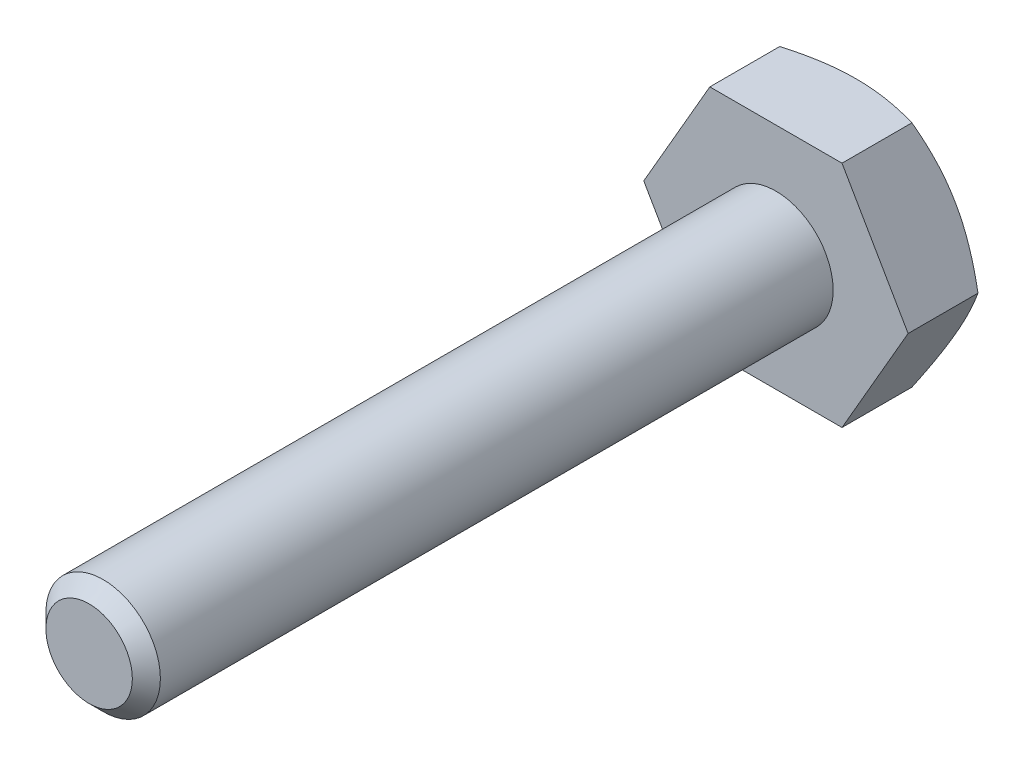
ISO-10303-21;
HEADER;
FILE_DESCRIPTION(('STEP AP214'),'2;1');
FILE_NAME('part.step','',(''),(''),'','','');
FILE_SCHEMA(('AUTOMOTIVE_DESIGN { 1 0 10303 214 1 1 1 1 }'));
ENDSEC;
DATA;
#1=APPLICATION_CONTEXT('core data for automotive mechanical design processes');
#2=APPLICATION_PROTOCOL_DEFINITION('international standard','automotive_design',2000,#1);
#3=PRODUCT_CONTEXT('',#1,'mechanical');
#4=PRODUCT('Part','Part','',(#3));
#5=PRODUCT_RELATED_PRODUCT_CATEGORY('part','',(#4));
#6=PRODUCT_DEFINITION_FORMATION('','',#4);
#7=PRODUCT_DEFINITION_CONTEXT('part definition',#1,'design');
#8=PRODUCT_DEFINITION('design','',#6,#7);
#9=PRODUCT_DEFINITION_SHAPE('','',#8);
#10=(LENGTH_UNIT() NAMED_UNIT(*) SI_UNIT(.MILLI.,.METRE.));
#11=(NAMED_UNIT(*) PLANE_ANGLE_UNIT() SI_UNIT($,.RADIAN.));
#12=(NAMED_UNIT(*) SI_UNIT($,.STERADIAN.) SOLID_ANGLE_UNIT());
#13=UNCERTAINTY_MEASURE_WITH_UNIT(LENGTH_MEASURE(1.E-05),#10,'distance_accuracy_value','');
#14=(GEOMETRIC_REPRESENTATION_CONTEXT(3) GLOBAL_UNCERTAINTY_ASSIGNED_CONTEXT((#13)) GLOBAL_UNIT_ASSIGNED_CONTEXT((#10,
#11,#12)) REPRESENTATION_CONTEXT('',''));
#15=CARTESIAN_POINT('',(0.,0.,0.));
#16=DIRECTION('',(0.,0.,1.));
#17=DIRECTION('',(1.,0.,0.));
#18=AXIS2_PLACEMENT_3D('',#15,#16,#17);
#19=CARTESIAN_POINT('',(1.15470053837925,-2.,1.4));
#20=DIRECTION('',(-0.866025403784439,0.5,0.));
#21=DIRECTION('',(-0.5,-0.866025403784439,0.));
#22=AXIS2_PLACEMENT_3D('',#19,#20,#21);
#23=PLANE('',#22);
#24=CARTESIAN_POINT('',(2.30951654681234,0.000200000000002191,0.1786994666205));
#25=CARTESIAN_POINT('',(2.25877250251758,-0.0876912629000578,0.149389536100684));
#26=CARTESIAN_POINT('',(2.20759044065996,-0.176341194473589,0.122732851980475));
#27=CARTESIAN_POINT('',(2.10433997494456,-0.355176246997799,0.0762024910207337));
#28=CARTESIAN_POINT('',(2.05226973594631,-0.445364546505033,0.0563452763827937));
#29=CARTESIAN_POINT('',(1.94877459684593,-0.624623385763302,0.0254334640232692));
#30=CARTESIAN_POINT('',(1.89736562427197,-0.7136663382263,0.0141731515985483));
#31=CARTESIAN_POINT('',(1.79430568008403,-0.892171397785038,0.00072866259465937));
#32=CARTESIAN_POINT('',(1.74265508327245,-0.981632855703953,-0.0014666450465144));
#33=CARTESIAN_POINT('',(1.64613626458982,-1.14880835354879,0.00309098933066325));
#34=CARTESIAN_POINT('',(1.60125362236173,-1.22654737026578,0.00872487468702659));
#35=CARTESIAN_POINT('',(1.51178075956051,-1.38151891453613,0.0265838952608438));
#36=CARTESIAN_POINT('',(1.46719084864821,-1.45875090574119,0.0388151360234607));
#37=CARTESIAN_POINT('',(1.37753338590959,-1.6140421864822,0.0693934368676312));
#38=CARTESIAN_POINT('',(1.33247718647009,-1.69208181310738,0.0878701670657312));
#39=CARTESIAN_POINT('',(1.24303693915875,-1.84699686569213,0.12980551821286));
#40=CARTESIAN_POINT('',(1.1986517446858,-1.92387427762312,0.153254280492312));
#41=CARTESIAN_POINT('',(1.15458506832541,-2.0002,0.178699466620498));
#42=B_SPLINE_CURVE_WITH_KNOTS('',3,(#24,#25,#26,#27,#28,#29,#30,#31,#32,#33,#34,#35,#36,#37,#38,
#39,#40,#41),.UNSPECIFIED.,.F.,.F.,(4,2,2,2,2,2,2,2,4),(0.,0.317031824695607,0.634825876346559,
0.944753967652631,1.25430138000371,1.52387047293093,1.79368946861028,2.06949491027633,
2.34475850821472),.UNSPECIFIED.);
#43=CARTESIAN_POINT('',(2.30940107675846,0.,0.178632794954067));
#44=VERTEX_POINT('',#43);
#45=CARTESIAN_POINT('',(1.73205080756888,-1.,0.));
#46=VERTEX_POINT('',#45);
#47=EDGE_CURVE('E130',#44,#46,#42,.T.);
#48=ORIENTED_EDGE('',*,*,#47,.F.);
#49=DIRECTION('',(0.,0.,-1.));
#50=VECTOR('',#49,1.);
#51=CARTESIAN_POINT('',(2.3094010767585,0.,1.4));
#52=LINE('',#51,#50);
#53=CARTESIAN_POINT('',(2.3094010767585,0.,1.4));
#54=VERTEX_POINT('',#53);
#55=EDGE_CURVE('E134',#54,#44,#52,.T.);
#56=ORIENTED_EDGE('',*,*,#55,.F.);
#57=DIRECTION('',(0.5,0.866025403784439,0.));
#58=VECTOR('',#57,1.);
#59=CARTESIAN_POINT('',(1.15470053837925,-2.,1.4));
#60=LINE('',#59,#58);
#61=CARTESIAN_POINT('',(1.15470053837925,-2.,1.4));
#62=VERTEX_POINT('',#61);
#63=EDGE_CURVE('E248',#62,#54,#60,.T.);
#64=ORIENTED_EDGE('',*,*,#63,.F.);
#65=DIRECTION('',(0.,0.,-1.));
#66=VECTOR('',#65,1.);
#67=CARTESIAN_POINT('',(1.15470053837925,-2.,1.4));
#68=LINE('',#67,#66);
#69=CARTESIAN_POINT('',(1.15470053837916,-2.,0.178632794954062));
#70=VERTEX_POINT('',#69);
#71=EDGE_CURVE('E224',#62,#70,#68,.T.);
#72=ORIENTED_EDGE('',*,*,#71,.T.);
#73=EDGE_CURVE('E187',#46,#70,#42,.T.);
#74=ORIENTED_EDGE('',*,*,#73,.F.);
#75=EDGE_LOOP('',(#48,#56,#64,#72,#74));
#76=FACE_BOUND('',#75,.T.);
#77=ADVANCED_FACE('F38',(#76),#23,.F.);
#78=CARTESIAN_POINT('',(2.3094010767585,0.,1.4));
#79=DIRECTION('',(-0.866025403784438,-0.5,0.));
#80=DIRECTION('',(0.5,-0.866025403784438,0.));
#81=AXIS2_PLACEMENT_3D('',#78,#79,#80);
#82=PLANE('',#81);
#83=CARTESIAN_POINT('',(1.15458506832541,2.0002,0.178699466620506));
#84=CARTESIAN_POINT('',(1.20532911262018,1.91230873709994,0.149389536100688));
#85=CARTESIAN_POINT('',(1.2565111744778,1.82365880552641,0.122732851980478));
#86=CARTESIAN_POINT('',(1.35976164019319,1.6448237530022,0.0762024910207348));
#87=CARTESIAN_POINT('',(1.41183187919145,1.55463545349497,0.056345276382794));
#88=CARTESIAN_POINT('',(1.51532701829183,1.3753766142367,0.0254334640232685));
#89=CARTESIAN_POINT('',(1.56673599086578,1.2863336617737,0.0141731515985472));
#90=CARTESIAN_POINT('',(1.66979593505373,1.10782860221496,0.000728662594657717));
#91=CARTESIAN_POINT('',(1.72144653186531,1.01836714429605,-0.00146664504651619));
#92=CARTESIAN_POINT('',(1.81796535054794,0.851191646451207,0.00309098933066134));
#93=CARTESIAN_POINT('',(1.86284799277603,0.773452629734221,0.0087248746870247));
#94=CARTESIAN_POINT('',(1.95232085557725,0.618481085463871,0.0265838952608436));
#95=CARTESIAN_POINT('',(1.99691076648954,0.541249094258806,0.0388151360234621));
#96=CARTESIAN_POINT('',(2.08656822922816,0.385957813517802,0.069393436867631));
#97=CARTESIAN_POINT('',(2.13162442866767,0.307918186892621,0.0878701670657276));
#98=CARTESIAN_POINT('',(2.221064675979,0.153003134307863,0.129805518212855));
#99=CARTESIAN_POINT('',(2.26544987045196,0.076125722376877,0.153254280492309));
#100=CARTESIAN_POINT('',(2.30951654681234,-0.000200000000001502,0.178699466620505));
#101=B_SPLINE_CURVE_WITH_KNOTS('',3,(#83,#84,#85,#86,#87,#88,#89,#90,#91,#92,#93,#94,#95,#96,
#97,#98,#99,#100),.UNSPECIFIED.,.F.,.F.,(4,2,2,2,2,2,2,2,4),(0.,0.317031824695607,
0.634825876346559,0.94475396765263,1.2543013800037,1.52387047293093,1.79368946861028,
2.06949491027634,2.34475850821472),.UNSPECIFIED.);
#102=CARTESIAN_POINT('',(1.1547005383793,1.99999999999992,0.178632794954066));
#103=VERTEX_POINT('',#102);
#104=CARTESIAN_POINT('',(1.73205080756888,1.,0.));
#105=VERTEX_POINT('',#104);
#106=EDGE_CURVE('E109',#103,#105,#101,.T.);
#107=ORIENTED_EDGE('',*,*,#106,.F.);
#108=DIRECTION('',(0.,0.,-1.));
#109=VECTOR('',#108,1.);
#110=CARTESIAN_POINT('',(1.15470053837925,2.,1.4));
#111=LINE('',#110,#109);
#112=CARTESIAN_POINT('',(1.15470053837925,2.,1.4));
#113=VERTEX_POINT('',#112);
#114=EDGE_CURVE('E233',#113,#103,#111,.T.);
#115=ORIENTED_EDGE('',*,*,#114,.F.);
#116=DIRECTION('',(-0.5,0.866025403784438,0.));
#117=VECTOR('',#116,1.);
#118=CARTESIAN_POINT('',(2.3094010767585,0.,1.4));
#119=LINE('',#118,#117);
#120=EDGE_CURVE('E252',#54,#113,#119,.T.);
#121=ORIENTED_EDGE('',*,*,#120,.F.);
#122=ORIENTED_EDGE('',*,*,#55,.T.);
#123=EDGE_CURVE('E122',#105,#44,#101,.T.);
#124=ORIENTED_EDGE('',*,*,#123,.F.);
#125=EDGE_LOOP('',(#107,#115,#121,#122,#124));
#126=FACE_BOUND('',#125,.T.);
#127=ADVANCED_FACE('F142',(#126),#82,.F.);
#128=CARTESIAN_POINT('',(1.15470053837925,2.,1.4));
#129=DIRECTION('',(0.,-1.,0.));
#130=DIRECTION('',(0.,0.,-1.));
#131=AXIS2_PLACEMENT_3D('',#128,#129,#130);
#132=PLANE('',#131);
#133=CARTESIAN_POINT('',(-3.13534334829022,2.,0.992419851947267));
#134=CARTESIAN_POINT('',(-3.04769056741261,2.,0.94976607451534));
#135=CARTESIAN_POINT('',(-2.95984013138572,2.,0.907511692400299));
#136=CARTESIAN_POINT('',(-2.78363894118423,2.,0.824025729231618));
#137=CARTESIAN_POINT('',(-2.69528811369076,2.,0.782794303090245));
#138=CARTESIAN_POINT('',(-2.51754201332114,2.,0.701378042506422));
#139=CARTESIAN_POINT('',(-2.42814369215806,2.,0.661199840612384));
#140=CARTESIAN_POINT('',(-2.248647562412,2.,0.582443619303133));
#141=CARTESIAN_POINT('',(-2.15854978616801,2.,0.54386552642451));
#142=CARTESIAN_POINT('',(-1.97449120953333,2.,0.467477454310918));
#143=CARTESIAN_POINT('',(-1.88050180526061,2.,0.429736028966731));
#144=CARTESIAN_POINT('',(-1.69145457213209,2.,0.357036466167304));
#145=CARTESIAN_POINT('',(-1.5963968380452,2.,0.322078084024595));
#146=CARTESIAN_POINT('',(-1.40520112576382,2.,0.255825829286189));
#147=CARTESIAN_POINT('',(-1.30906552059303,2.,0.224525175755738));
#148=CARTESIAN_POINT('',(-1.11541575793119,2.,0.166574285470996));
#149=CARTESIAN_POINT('',(-1.01790203404881,2.,0.139922619696653));
#150=CARTESIAN_POINT('',(-0.821976174511055,2.,0.0926670884452833));
#151=CARTESIAN_POINT('',(-0.723572216859774,2.,0.0720299350199858));
#152=CARTESIAN_POINT('',(-0.525507010533388,2.,0.03794899894518));
#153=CARTESIAN_POINT('',(-0.425845896027191,2.,0.024504455209211));
#154=CARTESIAN_POINT('',(-0.227075895666027,2.,0.00605918306906894));
#155=CARTESIAN_POINT('',(-0.127977630916021,2.,0.000947242980576258));
#156=CARTESIAN_POINT('',(0.0702888231789155,2.,-0.000707077894732916));
#157=CARTESIAN_POINT('',(0.169457013763535,2.,0.0027506972713517));
#158=CARTESIAN_POINT('',(0.405340987917955,2.,0.0208712518656598));
#159=CARTESIAN_POINT('',(0.54176641390941,2.,0.0393457317957802));
#160=CARTESIAN_POINT('',(0.812197875489501,2.,0.0893685196574088));
#161=CARTESIAN_POINT('',(0.946201565003888,2.,0.120928863137604));
#162=CARTESIAN_POINT('',(1.21460196893192,2.,0.194491535397711));
#163=CARTESIAN_POINT('',(1.34893512979176,2.,0.236719970019415));
#164=CARTESIAN_POINT('',(1.54855280747333,2.,0.305342715351825));
#165=CARTESIAN_POINT('',(1.61477299958935,2.,0.329094813825006));
#166=CARTESIAN_POINT('',(1.74666219780875,2.,0.378083109216497));
#167=CARTESIAN_POINT('',(1.8123312154833,2.,0.403319274889279));
#168=CARTESIAN_POINT('',(1.98595823229527,2.,0.471931368670434));
#169=CARTESIAN_POINT('',(2.09349170602536,2.,0.516378893507379));
#170=CARTESIAN_POINT('',(2.30748039073841,2.,0.60780685198962));
#171=CARTESIAN_POINT('',(2.4139354942457,2.,0.654787535208232));
#172=CARTESIAN_POINT('',(2.62600576848778,2.,0.750691732943658));
#173=CARTESIAN_POINT('',(2.73162065432965,2.,0.79961587532843));
#174=CARTESIAN_POINT('',(2.94214604404922,2.,0.898959617553906));
#175=CARTESIAN_POINT('',(3.04705652749655,2.,0.949379260542065));
#176=CARTESIAN_POINT('',(3.36124828857341,2.,1.10253125959176));
#177=CARTESIAN_POINT('',(3.5696761290435,2.,1.20701228486226));
#178=CARTESIAN_POINT('',(3.98496523954024,2.,1.41892202629211));
#179=CARTESIAN_POINT('',(4.19182680591951,2.,1.52635016609927));
#180=CARTESIAN_POINT('',(4.58330895745404,2.,1.7321007326676));
#181=CARTESIAN_POINT('',(4.76803326976603,2.,1.83022614129034));
#182=CARTESIAN_POINT('',(5.13685390610821,2.,2.02767337911895));
#183=CARTESIAN_POINT('',(5.32095019358253,2.,2.1269952764948));
#184=CARTESIAN_POINT('',(5.68806820425146,2.,2.32620881854463));
#185=CARTESIAN_POINT('',(5.87109147945917,2.,2.42609760652711));
#186=CARTESIAN_POINT('',(6.23674517550554,2.,2.62655964413539));
#187=CARTESIAN_POINT('',(6.41937562467911,2.,2.72713284205542));
#188=CARTESIAN_POINT('',(6.60186720952054,2.,2.82795563776509));
#189=B_SPLINE_CURVE_WITH_KNOTS('',3,(#133,#134,#135,#136,#137,#138,#139,#140,#141,#142,#143,
#144,#145,#146,#147,#148,#149,#150,#151,#152,#153,#154,#155,#156,#157,#158,#159,#160,#161,#162,
#163,#164,#165,#166,#167,#168,#169,#170,#171,#172,#173,#174,#175,#176,#177,#178,#179,#180,#181,
#182,#183,#184,#185,#186,#187,#188),.UNSPECIFIED.,.F.,.F.,(4,2,2,2,2,2,2,2,2,2,2,2,2,2,2,2,2,2,
2,2,2,2,2,2,2,2,2,4),(0.,0.292443481987672,0.58493098339391,0.878954340870048,1.17296418431592,
1.47678188482312,1.78057284385738,2.08379136768076,2.38691652239516,2.68833067284292,
2.98971292282126,3.28703880266869,3.58437009333465,3.99653269842381,4.40907522843046,
4.83122730377953,5.04226871027039,5.25330567508846,5.60233094671678,5.95139066827489,
6.30056409164291,6.64974759901018,7.34915048878023,8.04841756146948,8.67591854123585,
9.30345544358246,9.92897567671615,10.5544491664054),.UNSPECIFIED.);
#190=CARTESIAN_POINT('',(-1.1547005383793,1.99999999999992,0.178632794954067));
#191=VERTEX_POINT('',#190);
#192=CARTESIAN_POINT('',(0.,2.,0.));
#193=VERTEX_POINT('',#192);
#194=EDGE_CURVE('E53',#191,#193,#189,.T.);
#195=ORIENTED_EDGE('',*,*,#194,.F.);
#196=DIRECTION('',(0.,0.,-1.));
#197=VECTOR('',#196,1.);
#198=CARTESIAN_POINT('',(-1.15470053837925,2.,1.4));
#199=LINE('',#198,#197);
#200=CARTESIAN_POINT('',(-1.15470053837925,2.,1.4));
#201=VERTEX_POINT('',#200);
#202=EDGE_CURVE('E226',#201,#191,#199,.T.);
#203=ORIENTED_EDGE('',*,*,#202,.F.);
#204=DIRECTION('',(-1.,0.,0.));
#205=VECTOR('',#204,1.);
#206=CARTESIAN_POINT('',(1.15470053837925,2.,1.4));
#207=LINE('',#206,#205);
#208=EDGE_CURVE('E256',#113,#201,#207,.T.);
#209=ORIENTED_EDGE('',*,*,#208,.F.);
#210=ORIENTED_EDGE('',*,*,#114,.T.);
#211=EDGE_CURVE('E116',#193,#103,#189,.T.);
#212=ORIENTED_EDGE('',*,*,#211,.F.);
#213=EDGE_LOOP('',(#195,#203,#209,#210,#212));
#214=FACE_BOUND('',#213,.T.);
#215=ADVANCED_FACE('F197',(#214),#132,.F.);
#216=CARTESIAN_POINT('',(-1.15470053837925,2.,1.4));
#217=DIRECTION('',(0.866025403784439,-0.5,0.));
#218=DIRECTION('',(0.5,0.866025403784439,0.));
#219=AXIS2_PLACEMENT_3D('',#216,#217,#218);
#220=PLANE('',#219);
#221=CARTESIAN_POINT('',(-2.30951654681234,-0.000199999999999577,0.1786994666205));
#222=CARTESIAN_POINT('',(-2.25877250251757,0.0876912629000609,0.149389536100689));
#223=CARTESIAN_POINT('',(-2.20759044065995,0.176341194473591,0.122732851980478));
#224=CARTESIAN_POINT('',(-2.10433997494456,0.355176246997799,0.0762024910207319));
#225=CARTESIAN_POINT('',(-2.05226973594631,0.445364546505032,0.0563452763827881));
#226=CARTESIAN_POINT('',(-1.94877459684593,0.6246233857633,0.0254334640232629));
#227=CARTESIAN_POINT('',(-1.89736562427197,0.713666338226298,0.0141731515985448));
#228=CARTESIAN_POINT('',(-1.79430568008403,0.892171397785036,0.000728662594659934));
#229=CARTESIAN_POINT('',(-1.74265508327245,0.98163285570395,-0.00146664504651272));
#230=CARTESIAN_POINT('',(-1.64613626458982,1.14880835354879,0.00309098933066601));
#231=CARTESIAN_POINT('',(-1.60125362236173,1.22654737026578,0.00872487468702949));
#232=CARTESIAN_POINT('',(-1.51178075956051,1.38151891453613,0.0265838952608464));
#233=CARTESIAN_POINT('',(-1.46719084864821,1.45875090574119,0.0388151360234628));
#234=CARTESIAN_POINT('',(-1.37753338590959,1.6140421864822,0.0693934368676323));
#235=CARTESIAN_POINT('',(-1.33247718647009,1.69208181310738,0.0878701670657318));
#236=CARTESIAN_POINT('',(-1.24303693915875,1.84699686569213,0.12980551821286));
#237=CARTESIAN_POINT('',(-1.1986517446858,1.92387427762312,0.153254280492313));
#238=CARTESIAN_POINT('',(-1.15458506832541,2.0002,0.178699466620499));
#239=B_SPLINE_CURVE_WITH_KNOTS('',3,(#221,#222,#223,#224,#225,#226,#227,#228,#229,#230,#231,
#232,#233,#234,#235,#236,#237,#238),.UNSPECIFIED.,.F.,.F.,(4,2,2,2,2,2,2,2,4),(0.,
0.317031824695606,0.634825876346555,0.944753967652625,1.2543013800037,1.52387047293093,
1.79368946861027,2.06949491027633,2.34475850821472),.UNSPECIFIED.);
#240=CARTESIAN_POINT('',(-2.30940107675845,0.,0.178632794954064));
#241=VERTEX_POINT('',#240);
#242=CARTESIAN_POINT('',(-1.73205080756888,1.,0.));
#243=VERTEX_POINT('',#242);
#244=EDGE_CURVE('E61',#241,#243,#239,.T.);
#245=ORIENTED_EDGE('',*,*,#244,.F.);
#246=DIRECTION('',(0.,0.,-1.));
#247=VECTOR('',#246,1.);
#248=CARTESIAN_POINT('',(-2.3094010767585,0.,1.4));
#249=LINE('',#248,#247);
#250=CARTESIAN_POINT('',(-2.3094010767585,0.,1.4));
#251=VERTEX_POINT('',#250);
#252=EDGE_CURVE('E223',#251,#241,#249,.T.);
#253=ORIENTED_EDGE('',*,*,#252,.F.);
#254=DIRECTION('',(-0.5,-0.866025403784438,0.));
#255=VECTOR('',#254,1.);
#256=CARTESIAN_POINT('',(-1.15470053837925,2.,1.4));
#257=LINE('',#256,#255);
#258=EDGE_CURVE('E258',#201,#251,#257,.T.);
#259=ORIENTED_EDGE('',*,*,#258,.F.);
#260=ORIENTED_EDGE('',*,*,#202,.T.);
#261=EDGE_CURVE('E121',#243,#191,#239,.T.);
#262=ORIENTED_EDGE('',*,*,#261,.F.);
#263=EDGE_LOOP('',(#245,#253,#259,#260,#262));
#264=FACE_BOUND('',#263,.T.);
#265=ADVANCED_FACE('F242',(#264),#220,.F.);
#266=CARTESIAN_POINT('',(-2.3094010767585,0.,1.4));
#267=DIRECTION('',(0.866025403784438,0.5,0.));
#268=DIRECTION('',(-0.5,0.866025403784439,0.));
#269=AXIS2_PLACEMENT_3D('',#266,#267,#268);
#270=PLANE('',#269);
#271=CARTESIAN_POINT('',(-1.15458506832541,-2.0002,0.178699466620506));
#272=CARTESIAN_POINT('',(-1.20532911262018,-1.91230873709994,0.14938953610068));
#273=CARTESIAN_POINT('',(-1.2565111744778,-1.82365880552641,0.122732851980469));
#274=CARTESIAN_POINT('',(-1.35976164019319,-1.6448237530022,0.07620249102073));
#275=CARTESIAN_POINT('',(-1.41183187919145,-1.55463545349497,0.0563452763827934));
#276=CARTESIAN_POINT('',(-1.51532701829183,-1.3753766142367,0.0254334640232713));
#277=CARTESIAN_POINT('',(-1.56673599086578,-1.2863336617737,0.0141731515985492));
#278=CARTESIAN_POINT('',(-1.66979593505373,-1.10782860221496,0.000728662594657123));
#279=CARTESIAN_POINT('',(-1.72144653186531,-1.01836714429605,-0.0014666450465188));
#280=CARTESIAN_POINT('',(-1.81796535054794,-0.851191646451207,0.00309098933066318));
#281=CARTESIAN_POINT('',(-1.86284799277603,-0.773452629734221,0.00872487468703193));
#282=CARTESIAN_POINT('',(-1.95232085557724,-0.618481085463871,0.0265838952608489));
#283=CARTESIAN_POINT('',(-1.99691076648954,-0.541249094258806,0.0388151360234602));
#284=CARTESIAN_POINT('',(-2.08656822922816,-0.385957813517802,0.0693934368676261));
#285=CARTESIAN_POINT('',(-2.13162442866766,-0.307918186892622,0.0878701670657273));
#286=CARTESIAN_POINT('',(-2.221064675979,-0.153003134307865,0.129805518212859));
#287=CARTESIAN_POINT('',(-2.26544987045196,-0.0761257223768784,0.153254280492312));
#288=CARTESIAN_POINT('',(-2.30951654681234,0.000200000000001954,0.178699466620497));
#289=B_SPLINE_CURVE_WITH_KNOTS('',3,(#271,#272,#273,#274,#275,#276,#277,#278,#279,#280,#281,
#282,#283,#284,#285,#286,#287,#288),.UNSPECIFIED.,.F.,.F.,(4,2,2,2,2,2,2,2,4),(0.,
0.317031824695607,0.634825876346559,0.94475396765263,1.2543013800037,1.52387047293093,
1.79368946861028,2.06949491027633,2.34475850821472),.UNSPECIFIED.);
#290=CARTESIAN_POINT('',(-1.15470053837929,-2.,0.178632794953966));
#291=VERTEX_POINT('',#290);
#292=CARTESIAN_POINT('',(-1.73205080756888,-1.,0.));
#293=VERTEX_POINT('',#292);
#294=EDGE_CURVE('E181',#291,#293,#289,.T.);
#295=ORIENTED_EDGE('',*,*,#294,.F.);
#296=DIRECTION('',(0.,0.,-1.));
#297=VECTOR('',#296,1.);
#298=CARTESIAN_POINT('',(-1.15470053837925,-2.,1.4));
#299=LINE('',#298,#297);
#300=CARTESIAN_POINT('',(-1.15470053837925,-2.,1.4));
#301=VERTEX_POINT('',#300);
#302=EDGE_CURVE('E217',#301,#291,#299,.T.);
#303=ORIENTED_EDGE('',*,*,#302,.F.);
#304=DIRECTION('',(0.5,-0.866025403784439,0.));
#305=VECTOR('',#304,1.);
#306=CARTESIAN_POINT('',(-2.3094010767585,0.,1.4));
#307=LINE('',#306,#305);
#308=EDGE_CURVE('E260',#251,#301,#307,.T.);
#309=ORIENTED_EDGE('',*,*,#308,.F.);
#310=ORIENTED_EDGE('',*,*,#252,.T.);
#311=EDGE_CURVE('E144',#293,#241,#289,.T.);
#312=ORIENTED_EDGE('',*,*,#311,.F.);
#313=EDGE_LOOP('',(#295,#303,#309,#310,#312));
#314=FACE_BOUND('',#313,.T.);
#315=ADVANCED_FACE('F215',(#314),#270,.F.);
#316=CARTESIAN_POINT('',(-1.15470053837925,-2.,1.4));
#317=DIRECTION('',(0.,1.,0.));
#318=DIRECTION('',(0.,0.,1.));
#319=AXIS2_PLACEMENT_3D('',#316,#317,#318);
#320=PLANE('',#319);
#321=CARTESIAN_POINT('',(-3.13534334829022,-2.,0.992419851947267));
#322=CARTESIAN_POINT('',(-3.04769056741262,-2.,0.949766074515333));
#323=CARTESIAN_POINT('',(-2.95984013138573,-2.,0.907511692400291));
#324=CARTESIAN_POINT('',(-2.78363894118423,-2.,0.824025729231613));
#325=CARTESIAN_POINT('',(-2.69528811369076,-2.,0.782794303090244));
#326=CARTESIAN_POINT('',(-2.51754201332114,-2.,0.701378042506423));
#327=CARTESIAN_POINT('',(-2.42814369215806,-2.,0.661199840612384));
#328=CARTESIAN_POINT('',(-2.24864756241199,-2.,0.582443619303134));
#329=CARTESIAN_POINT('',(-2.15854978616801,-2.,0.543865526424512));
#330=CARTESIAN_POINT('',(-1.97449120953333,-2.,0.467477454310917));
#331=CARTESIAN_POINT('',(-1.88050180526061,-2.,0.429736028966724));
#332=CARTESIAN_POINT('',(-1.69145457213209,-2.,0.357036466167297));
#333=CARTESIAN_POINT('',(-1.5963968380452,-2.,0.322078084024593));
#334=CARTESIAN_POINT('',(-1.40520112576382,-2.,0.255825829286191));
#335=CARTESIAN_POINT('',(-1.30906552059303,-2.,0.224525175755738));
#336=CARTESIAN_POINT('',(-1.11541575793119,-2.,0.166574285470995));
#337=CARTESIAN_POINT('',(-1.01790203404881,-2.,0.139922619696653));
#338=CARTESIAN_POINT('',(-0.821976174511054,-2.,0.0926670884452834));
#339=CARTESIAN_POINT('',(-0.723572216859773,-2.,0.0720299350199858));
#340=CARTESIAN_POINT('',(-0.525507010533388,-2.,0.03794899894518));
#341=CARTESIAN_POINT('',(-0.42584589602719,-2.,0.024504455209211));
#342=CARTESIAN_POINT('',(-0.227075895666026,-2.,0.00605918306906898));
#343=CARTESIAN_POINT('',(-0.127977630916021,-2.,0.000947242980576301));
#344=CARTESIAN_POINT('',(0.070288823178916,-2.,-0.000707077894732863));
#345=CARTESIAN_POINT('',(0.169457013763536,-2.,0.00275069727135177));
#346=CARTESIAN_POINT('',(0.405340987917956,-2.,0.0208712518656598));
#347=CARTESIAN_POINT('',(0.541766413909411,-2.,0.0393457317957802));
#348=CARTESIAN_POINT('',(0.812197875489503,-2.,0.0893685196574088));
#349=CARTESIAN_POINT('',(0.946201565003889,-2.,0.120928863137604));
#350=CARTESIAN_POINT('',(1.21460196893192,-2.,0.194491535397711));
#351=CARTESIAN_POINT('',(1.34893512979177,-2.,0.236719970019415));
#352=CARTESIAN_POINT('',(1.54855280747333,-2.,0.305342715351826));
#353=CARTESIAN_POINT('',(1.61477299958935,-2.,0.329094813825006));
#354=CARTESIAN_POINT('',(1.74666219780875,-2.,0.378083109216497));
#355=CARTESIAN_POINT('',(1.8123312154833,-2.,0.403319274889279));
#356=CARTESIAN_POINT('',(1.98595823229527,-2.,0.471931368670435));
#357=CARTESIAN_POINT('',(2.09349170602536,-2.,0.516378893507379));
#358=CARTESIAN_POINT('',(2.30748039073841,-2.,0.607806851989619));
#359=CARTESIAN_POINT('',(2.4139354942457,-2.,0.654787535208232));
#360=CARTESIAN_POINT('',(2.62600576848778,-2.,0.750691732943657));
#361=CARTESIAN_POINT('',(2.73162065432965,-2.,0.799615875328427));
#362=CARTESIAN_POINT('',(2.94214604404923,-2.,0.898959617553903));
#363=CARTESIAN_POINT('',(3.04705652749655,-2.,0.949379260542062));
#364=CARTESIAN_POINT('',(3.36124828857341,-2.,1.10253125959176));
#365=CARTESIAN_POINT('',(3.5696761290435,-2.,1.20701228486227));
#366=CARTESIAN_POINT('',(3.98496523954024,-2.,1.41892202629212));
#367=CARTESIAN_POINT('',(4.19182680591951,-2.,1.52635016609927));
#368=CARTESIAN_POINT('',(4.58330895745404,-2.,1.73210073266759));
#369=CARTESIAN_POINT('',(4.76803326976604,-2.,1.83022614129033));
#370=CARTESIAN_POINT('',(5.13685390610822,-2.,2.02767337911895));
#371=CARTESIAN_POINT('',(5.32095019358254,-2.,2.1269952764948));
#372=CARTESIAN_POINT('',(5.68806820425146,-2.,2.32620881854463));
#373=CARTESIAN_POINT('',(5.87109147945918,-2.,2.42609760652711));
#374=CARTESIAN_POINT('',(6.23674517550554,-2.,2.62655964413539));
#375=CARTESIAN_POINT('',(6.41937562467911,-2.,2.72713284205542));
#376=CARTESIAN_POINT('',(6.60186720952054,-2.,2.82795563776509));
#377=B_SPLINE_CURVE_WITH_KNOTS('',3,(#321,#322,#323,#324,#325,#326,#327,#328,#329,#330,#331,
#332,#333,#334,#335,#336,#337,#338,#339,#340,#341,#342,#343,#344,#345,#346,#347,#348,#349,#350,
#351,#352,#353,#354,#355,#356,#357,#358,#359,#360,#361,#362,#363,#364,#365,#366,#367,#368,#369,
#370,#371,#372,#373,#374,#375,#376),.UNSPECIFIED.,.F.,.F.,(4,2,2,2,2,2,2,2,2,2,2,2,2,2,2,2,2,2,
2,2,2,2,2,2,2,2,2,4),(0.,0.292443481987673,0.58493098339391,0.878954340870048,1.17296418431592,
1.47678188482312,1.78057284385738,2.08379136768076,2.38691652239516,2.68833067284292,
2.98971292282126,3.28703880266869,3.58437009333465,3.99653269842381,4.40907522843046,
4.83122730377953,5.04226871027039,5.25330567508846,5.60233094671678,5.95139066827488,
6.30056409164291,6.64974759901018,7.34915048878022,8.04841756146948,8.67591854123585,
9.30345544358246,9.92897567671615,10.5544491664054),.UNSPECIFIED.);
#378=CARTESIAN_POINT('',(0.,-2.,0.));
#379=VERTEX_POINT('',#378);
#380=EDGE_CURVE('E201',#70,#379,#377,.F.);
#381=ORIENTED_EDGE('',*,*,#380,.F.);
#382=ORIENTED_EDGE('',*,*,#71,.F.);
#383=DIRECTION('',(1.,0.,0.));
#384=VECTOR('',#383,1.);
#385=CARTESIAN_POINT('',(-1.15470053837925,-2.,1.4));
#386=LINE('',#385,#384);
#387=EDGE_CURVE('E222',#301,#62,#386,.T.);
#388=ORIENTED_EDGE('',*,*,#387,.F.);
#389=ORIENTED_EDGE('',*,*,#302,.T.);
#390=EDGE_CURVE('E139',#379,#291,#377,.F.);
#391=ORIENTED_EDGE('',*,*,#390,.F.);
#392=EDGE_LOOP('',(#381,#382,#388,#389,#391));
#393=FACE_BOUND('',#392,.T.);
#394=ADVANCED_FACE('F220',(#393),#320,.F.);
#395=CARTESIAN_POINT('',(2.3094010767585,0.,1.4));
#396=DIRECTION('',(0.,0.,1.));
#397=DIRECTION('',(1.,0.,0.));
#398=AXIS2_PLACEMENT_3D('',#395,#396,#397);
#399=PLANE('',#398);
#400=ORIENTED_EDGE('',*,*,#63,.T.);
#401=ORIENTED_EDGE('',*,*,#120,.T.);
#402=ORIENTED_EDGE('',*,*,#208,.T.);
#403=ORIENTED_EDGE('',*,*,#258,.T.);
#404=ORIENTED_EDGE('',*,*,#308,.T.);
#405=ORIENTED_EDGE('',*,*,#387,.T.);
#406=EDGE_LOOP('',(#400,#401,#402,#403,#404,#405));
#407=FACE_BOUND('',#406,.T.);
#408=CARTESIAN_POINT('',(0.,0.,1.4));
#409=DIRECTION('',(0.,0.,1.));
#410=DIRECTION('',(1.,0.,0.));
#411=AXIS2_PLACEMENT_3D('',#408,#409,#410);
#412=CIRCLE('',#411,1.);
#413=CARTESIAN_POINT('',(1.,0.,1.4));
#414=VERTEX_POINT('',#413);
#415=EDGE_CURVE('E246',#414,#414,#412,.T.);
#416=ORIENTED_EDGE('',*,*,#415,.F.);
#417=EDGE_LOOP('',(#416));
#418=FACE_BOUND('',#417,.T.);
#419=ADVANCED_FACE('F262',(#407,#418),#399,.T.);
#420=CARTESIAN_POINT('',(0.,0.,13.4));
#421=DIRECTION('',(0.,0.,-1.));
#422=DIRECTION('',(-1.,0.,0.));
#423=AXIS2_PLACEMENT_3D('',#420,#421,#422);
#424=CYLINDRICAL_SURFACE('',#423,1.);
#425=CARTESIAN_POINT('',(0.,0.,13.155));
#426=DIRECTION('',(0.,0.,1.));
#427=DIRECTION('',(1.,0.,0.));
#428=AXIS2_PLACEMENT_3D('',#425,#426,#427);
#429=CIRCLE('',#428,1.);
#430=CARTESIAN_POINT('',(1.,0.,13.155));
#431=VERTEX_POINT('',#430);
#432=EDGE_CURVE('E11',#431,#431,#429,.F.);
#433=ORIENTED_EDGE('',*,*,#432,.T.);
#434=EDGE_LOOP('',(#433));
#435=FACE_BOUND('',#434,.T.);
#436=ORIENTED_EDGE('',*,*,#415,.T.);
#437=EDGE_LOOP('',(#436));
#438=FACE_BOUND('',#437,.T.);
#439=ADVANCED_FACE('F280',(#435,#438),#424,.T.);
#440=CARTESIAN_POINT('',(0.,0.,13.4));
#441=DIRECTION('',(0.,0.,1.));
#442=DIRECTION('',(1.,0.,0.));
#443=AXIS2_PLACEMENT_3D('',#440,#441,#442);
#444=PLANE('',#443);
#445=CARTESIAN_POINT('',(0.,0.,13.4));
#446=DIRECTION('',(0.,0.,1.));
#447=DIRECTION('',(1.,0.,0.));
#448=AXIS2_PLACEMENT_3D('',#445,#446,#447);
#449=CIRCLE('',#448,0.755000000000002);
#450=CARTESIAN_POINT('',(0.755000000000002,0.,13.4));
#451=VERTEX_POINT('',#450);
#452=EDGE_CURVE('E46',#451,#451,#449,.T.);
#453=ORIENTED_EDGE('',*,*,#452,.T.);
#454=EDGE_LOOP('',(#453));
#455=FACE_BOUND('',#454,.T.);
#456=ADVANCED_FACE('F169',(#455),#444,.T.);
#457=CARTESIAN_POINT('',(0.,0.,57.7350269189618));
#458=DIRECTION('',(0.,0.,1.));
#459=DIRECTION('',(1.,0.,0.));
#460=AXIS2_PLACEMENT_3D('',#457,#458,#459);
#461=CONICAL_SURFACE('',#460,102.,1.0471975511966);
#462=ORIENTED_EDGE('',*,*,#123,.T.);
#463=ORIENTED_EDGE('',*,*,#47,.T.);
#464=CARTESIAN_POINT('',(0.,0.,0.));
#465=DIRECTION('',(0.,0.,1.));
#466=DIRECTION('',(1.,0.,0.));
#467=AXIS2_PLACEMENT_3D('',#464,#465,#466);
#468=CIRCLE('',#467,1.99999999999998);
#469=EDGE_CURVE('E127',#46,#105,#468,.T.);
#470=ORIENTED_EDGE('',*,*,#469,.T.);
#471=EDGE_LOOP('',(#462,#463,#470));
#472=FACE_BOUND('',#471,.T.);
#473=ADVANCED_FACE('F128',(#472),#461,.T.);
#474=ORIENTED_EDGE('',*,*,#73,.T.);
#475=ORIENTED_EDGE('',*,*,#380,.T.);
#476=EDGE_CURVE('E133',#379,#46,#468,.T.);
#477=ORIENTED_EDGE('',*,*,#476,.T.);
#478=EDGE_LOOP('',(#474,#475,#477));
#479=FACE_BOUND('',#478,.T.);
#480=ADVANCED_FACE('F239',(#479),#461,.T.);
#481=ORIENTED_EDGE('',*,*,#294,.T.);
#482=EDGE_CURVE('E210',#293,#379,#468,.T.);
#483=ORIENTED_EDGE('',*,*,#482,.T.);
#484=ORIENTED_EDGE('',*,*,#390,.T.);
#485=EDGE_LOOP('',(#481,#483,#484));
#486=FACE_BOUND('',#485,.T.);
#487=ADVANCED_FACE('F168',(#486),#461,.T.);
#488=ORIENTED_EDGE('',*,*,#244,.T.);
#489=EDGE_CURVE('E238',#243,#293,#468,.T.);
#490=ORIENTED_EDGE('',*,*,#489,.T.);
#491=ORIENTED_EDGE('',*,*,#311,.T.);
#492=EDGE_LOOP('',(#488,#490,#491));
#493=FACE_BOUND('',#492,.T.);
#494=ADVANCED_FACE('F167',(#493),#461,.T.);
#495=ORIENTED_EDGE('',*,*,#194,.T.);
#496=EDGE_CURVE('E136',#193,#243,#468,.T.);
#497=ORIENTED_EDGE('',*,*,#496,.T.);
#498=ORIENTED_EDGE('',*,*,#261,.T.);
#499=EDGE_LOOP('',(#495,#497,#498));
#500=FACE_BOUND('',#499,.T.);
#501=ADVANCED_FACE('F163',(#500),#461,.T.);
#502=ORIENTED_EDGE('',*,*,#211,.T.);
#503=ORIENTED_EDGE('',*,*,#106,.T.);
#504=CARTESIAN_POINT('',(0.,0.,0.));
#505=DIRECTION('',(0.,0.,1.));
#506=DIRECTION('',(1.,0.,0.));
#507=AXIS2_PLACEMENT_3D('',#504,#505,#506);
#508=CIRCLE('',#507,2.);
#509=EDGE_CURVE('E113',#105,#193,#508,.T.);
#510=ORIENTED_EDGE('',*,*,#509,.T.);
#511=EDGE_LOOP('',(#502,#503,#510));
#512=FACE_BOUND('',#511,.T.);
#513=ADVANCED_FACE('F111',(#512),#461,.T.);
#514=CARTESIAN_POINT('',(2.3094010767585,0.,0.));
#515=DIRECTION('',(0.,0.,1.));
#516=DIRECTION('',(1.,0.,0.));
#517=AXIS2_PLACEMENT_3D('',#514,#515,#516);
#518=PLANE('',#517);
#519=ORIENTED_EDGE('',*,*,#509,.F.);
#520=ORIENTED_EDGE('',*,*,#469,.F.);
#521=ORIENTED_EDGE('',*,*,#476,.F.);
#522=ORIENTED_EDGE('',*,*,#482,.F.);
#523=ORIENTED_EDGE('',*,*,#489,.F.);
#524=ORIENTED_EDGE('',*,*,#496,.F.);
#525=EDGE_LOOP('',(#519,#520,#521,#522,#523,#524));
#526=FACE_BOUND('',#525,.T.);
#527=ADVANCED_FACE('F137',(#526),#518,.F.);
#528=CARTESIAN_POINT('',(0.,0.,13.4));
#529=DIRECTION('',(0.,0.,-1.));
#530=DIRECTION('',(-1.,0.,0.));
#531=AXIS2_PLACEMENT_3D('',#528,#529,#530);
#532=CONICAL_SURFACE('',#531,0.755000000000002,0.785398163397443);
#533=ORIENTED_EDGE('',*,*,#432,.F.);
#534=EDGE_LOOP('',(#533));
#535=FACE_BOUND('',#534,.T.);
#536=ORIENTED_EDGE('',*,*,#452,.F.);
#537=EDGE_LOOP('',(#536));
#538=FACE_BOUND('',#537,.T.);
#539=ADVANCED_FACE('F40',(#535,#538),#532,.T.);
#540=CLOSED_SHELL('',(#77,#127,#215,#265,#315,#394,#419,#439,#456,#473,#480,#487,#494,#501,#513,
#527,#539));
#541=MANIFOLD_SOLID_BREP('B2',#540);
#542=ADVANCED_BREP_SHAPE_REPRESENTATION('',(#18,#541),#14);
#543=SHAPE_DEFINITION_REPRESENTATION(#9,#542);
ENDSEC;
END-ISO-10303-21;
